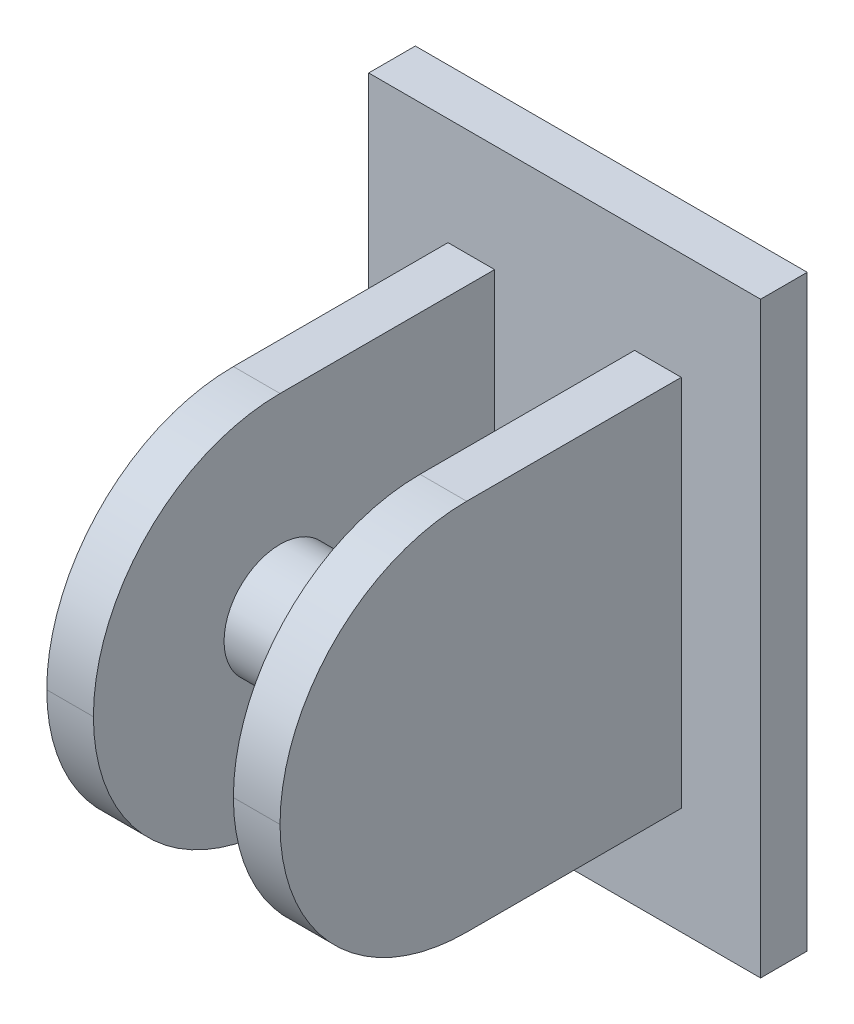
ISO-10303-21;
HEADER;
FILE_DESCRIPTION(('STEP AP214'),'2;1');
FILE_NAME('part.step','',(''),(''),'','','');
FILE_SCHEMA(('AUTOMOTIVE_DESIGN { 1 0 10303 214 1 1 1 1 }'));
ENDSEC;
DATA;
#1=APPLICATION_CONTEXT('core data for automotive mechanical design processes');
#2=APPLICATION_PROTOCOL_DEFINITION('international standard','automotive_design',2000,#1);
#3=PRODUCT_CONTEXT('',#1,'mechanical');
#4=PRODUCT('Part','Part','',(#3));
#5=PRODUCT_RELATED_PRODUCT_CATEGORY('part','',(#4));
#6=PRODUCT_DEFINITION_FORMATION('','',#4);
#7=PRODUCT_DEFINITION_CONTEXT('part definition',#1,'design');
#8=PRODUCT_DEFINITION('design','',#6,#7);
#9=PRODUCT_DEFINITION_SHAPE('','',#8);
#10=(LENGTH_UNIT() NAMED_UNIT(*) SI_UNIT(.MILLI.,.METRE.));
#11=(NAMED_UNIT(*) PLANE_ANGLE_UNIT() SI_UNIT($,.RADIAN.));
#12=(NAMED_UNIT(*) SI_UNIT($,.STERADIAN.) SOLID_ANGLE_UNIT());
#13=UNCERTAINTY_MEASURE_WITH_UNIT(LENGTH_MEASURE(1.E-05),#10,'distance_accuracy_value','');
#14=(GEOMETRIC_REPRESENTATION_CONTEXT(3) GLOBAL_UNCERTAINTY_ASSIGNED_CONTEXT((#13)) GLOBAL_UNIT_ASSIGNED_CONTEXT((#10,
#11,#12)) REPRESENTATION_CONTEXT('',''));
#15=CARTESIAN_POINT('',(0.,0.,0.));
#16=DIRECTION('',(0.,0.,1.));
#17=DIRECTION('',(1.,0.,0.));
#18=AXIS2_PLACEMENT_3D('',#15,#16,#17);
#19=CARTESIAN_POINT('',(-21.,-31.5,5.));
#20=DIRECTION('',(0.,0.,1.));
#21=DIRECTION('',(1.,0.,0.));
#22=AXIS2_PLACEMENT_3D('',#19,#20,#21);
#23=PLANE('',#22);
#24=DIRECTION('',(-1.,0.,0.));
#25=VECTOR('',#24,1.);
#26=CARTESIAN_POINT('',(-7.5,20.,5.));
#27=LINE('',#26,#25);
#28=CARTESIAN_POINT('',(-7.5,20.,5.));
#29=VERTEX_POINT('',#28);
#30=CARTESIAN_POINT('',(-12.5,20.,5.));
#31=VERTEX_POINT('',#30);
#32=EDGE_CURVE('E149',#29,#31,#27,.T.);
#33=ORIENTED_EDGE('',*,*,#32,.F.);
#34=DIRECTION('',(0.,1.,0.));
#35=VECTOR('',#34,1.);
#36=CARTESIAN_POINT('',(-7.5,20.,5.));
#37=LINE('',#36,#35);
#38=CARTESIAN_POINT('',(-7.5,-20.,5.));
#39=VERTEX_POINT('',#38);
#40=EDGE_CURVE('E123',#39,#29,#37,.T.);
#41=ORIENTED_EDGE('',*,*,#40,.F.);
#42=DIRECTION('',(1.,0.,0.));
#43=VECTOR('',#42,1.);
#44=CARTESIAN_POINT('',(-7.5,-20.,5.));
#45=LINE('',#44,#43);
#46=CARTESIAN_POINT('',(-12.5,-20.,5.));
#47=VERTEX_POINT('',#46);
#48=EDGE_CURVE('E155',#47,#39,#45,.T.);
#49=ORIENTED_EDGE('',*,*,#48,.F.);
#50=DIRECTION('',(0.,-1.,0.));
#51=VECTOR('',#50,1.);
#52=CARTESIAN_POINT('',(-12.5,20.,5.));
#53=LINE('',#52,#51);
#54=EDGE_CURVE('E152',#31,#47,#53,.T.);
#55=ORIENTED_EDGE('',*,*,#54,.F.);
#56=EDGE_LOOP('',(#33,#41,#49,#55));
#57=FACE_BOUND('',#56,.T.);
#58=DIRECTION('',(0.,-1.,0.));
#59=VECTOR('',#58,1.);
#60=CARTESIAN_POINT('',(-21.,31.5,5.));
#61=LINE('',#60,#59);
#62=CARTESIAN_POINT('',(-21.,31.5,5.));
#63=VERTEX_POINT('',#62);
#64=CARTESIAN_POINT('',(-21.,-31.5,5.));
#65=VERTEX_POINT('',#64);
#66=EDGE_CURVE('E175',#63,#65,#61,.T.);
#67=ORIENTED_EDGE('',*,*,#66,.T.);
#68=DIRECTION('',(1.,0.,0.));
#69=VECTOR('',#68,1.);
#70=CARTESIAN_POINT('',(-21.,-31.5,5.));
#71=LINE('',#70,#69);
#72=CARTESIAN_POINT('',(21.,-31.5,5.));
#73=VERTEX_POINT('',#72);
#74=EDGE_CURVE('E178',#65,#73,#71,.T.);
#75=ORIENTED_EDGE('',*,*,#74,.T.);
#76=DIRECTION('',(0.,1.,0.));
#77=VECTOR('',#76,1.);
#78=CARTESIAN_POINT('',(21.,31.5,5.));
#79=LINE('',#78,#77);
#80=CARTESIAN_POINT('',(21.,31.5,5.));
#81=VERTEX_POINT('',#80);
#82=EDGE_CURVE('E180',#73,#81,#79,.T.);
#83=ORIENTED_EDGE('',*,*,#82,.T.);
#84=DIRECTION('',(-1.,0.,0.));
#85=VECTOR('',#84,1.);
#86=CARTESIAN_POINT('',(-21.,31.5,5.));
#87=LINE('',#86,#85);
#88=EDGE_CURVE('E182',#81,#63,#87,.T.);
#89=ORIENTED_EDGE('',*,*,#88,.T.);
#90=EDGE_LOOP('',(#67,#75,#83,#89));
#91=FACE_BOUND('',#90,.T.);
#92=DIRECTION('',(1.,0.,0.));
#93=VECTOR('',#92,1.);
#94=CARTESIAN_POINT('',(7.5,-20.,5.));
#95=LINE('',#94,#93);
#96=CARTESIAN_POINT('',(7.5,-20.,5.));
#97=VERTEX_POINT('',#96);
#98=CARTESIAN_POINT('',(12.5,-20.,5.));
#99=VERTEX_POINT('',#98);
#100=EDGE_CURVE('E119',#97,#99,#95,.T.);
#101=ORIENTED_EDGE('',*,*,#100,.F.);
#102=DIRECTION('',(0.,-1.,0.));
#103=VECTOR('',#102,1.);
#104=CARTESIAN_POINT('',(7.5,20.,5.));
#105=LINE('',#104,#103);
#106=CARTESIAN_POINT('',(7.5,20.,5.));
#107=VERTEX_POINT('',#106);
#108=EDGE_CURVE('E127',#107,#97,#105,.T.);
#109=ORIENTED_EDGE('',*,*,#108,.F.);
#110=DIRECTION('',(-1.,0.,0.));
#111=VECTOR('',#110,1.);
#112=CARTESIAN_POINT('',(7.5,20.,5.));
#113=LINE('',#112,#111);
#114=CARTESIAN_POINT('',(12.5,20.,5.));
#115=VERTEX_POINT('',#114);
#116=EDGE_CURVE('E138',#115,#107,#113,.T.);
#117=ORIENTED_EDGE('',*,*,#116,.F.);
#118=DIRECTION('',(0.,1.,0.));
#119=VECTOR('',#118,1.);
#120=CARTESIAN_POINT('',(12.5,20.,5.));
#121=LINE('',#120,#119);
#122=EDGE_CURVE('E136',#99,#115,#121,.T.);
#123=ORIENTED_EDGE('',*,*,#122,.F.);
#124=EDGE_LOOP('',(#101,#109,#117,#123));
#125=FACE_BOUND('',#124,.T.);
#126=ADVANCED_FACE('F16',(#57,#91,#125),#23,.T.);
#127=CARTESIAN_POINT('',(-21.,31.5,5.));
#128=DIRECTION('',(1.,0.,0.));
#129=DIRECTION('',(0.,1.,0.));
#130=AXIS2_PLACEMENT_3D('',#127,#128,#129);
#131=PLANE('',#130);
#132=DIRECTION('',(0.,-1.,0.));
#133=VECTOR('',#132,1.);
#134=CARTESIAN_POINT('',(-21.,31.5,0.));
#135=LINE('',#134,#133);
#136=CARTESIAN_POINT('',(-21.,31.5,0.));
#137=VERTEX_POINT('',#136);
#138=CARTESIAN_POINT('',(-21.,-31.5,0.));
#139=VERTEX_POINT('',#138);
#140=EDGE_CURVE('E166',#137,#139,#135,.T.);
#141=ORIENTED_EDGE('',*,*,#140,.T.);
#142=DIRECTION('',(0.,0.,-1.));
#143=VECTOR('',#142,1.);
#144=CARTESIAN_POINT('',(-21.,-31.5,5.));
#145=LINE('',#144,#143);
#146=EDGE_CURVE('E193',#65,#139,#145,.T.);
#147=ORIENTED_EDGE('',*,*,#146,.F.);
#148=ORIENTED_EDGE('',*,*,#66,.F.);
#149=DIRECTION('',(0.,0.,-1.));
#150=VECTOR('',#149,1.);
#151=CARTESIAN_POINT('',(-21.,31.5,5.));
#152=LINE('',#151,#150);
#153=EDGE_CURVE('E184',#63,#137,#152,.T.);
#154=ORIENTED_EDGE('',*,*,#153,.T.);
#155=EDGE_LOOP('',(#141,#147,#148,#154));
#156=FACE_BOUND('',#155,.T.);
#157=ADVANCED_FACE('F18',(#156),#131,.F.);
#158=CARTESIAN_POINT('',(-21.,-31.5,5.));
#159=DIRECTION('',(0.,1.,0.));
#160=DIRECTION('',(0.,0.,1.));
#161=AXIS2_PLACEMENT_3D('',#158,#159,#160);
#162=PLANE('',#161);
#163=DIRECTION('',(1.,0.,0.));
#164=VECTOR('',#163,1.);
#165=CARTESIAN_POINT('',(-21.,-31.5,0.));
#166=LINE('',#165,#164);
#167=CARTESIAN_POINT('',(21.,-31.5,0.));
#168=VERTEX_POINT('',#167);
#169=EDGE_CURVE('E169',#139,#168,#166,.T.);
#170=ORIENTED_EDGE('',*,*,#169,.T.);
#171=DIRECTION('',(0.,0.,-1.));
#172=VECTOR('',#171,1.);
#173=CARTESIAN_POINT('',(21.,-31.5,5.));
#174=LINE('',#173,#172);
#175=EDGE_CURVE('E190',#73,#168,#174,.T.);
#176=ORIENTED_EDGE('',*,*,#175,.F.);
#177=ORIENTED_EDGE('',*,*,#74,.F.);
#178=ORIENTED_EDGE('',*,*,#146,.T.);
#179=EDGE_LOOP('',(#170,#176,#177,#178));
#180=FACE_BOUND('',#179,.T.);
#181=ADVANCED_FACE('F248',(#180),#162,.F.);
#182=CARTESIAN_POINT('',(21.,31.5,5.));
#183=DIRECTION('',(-1.,0.,0.));
#184=DIRECTION('',(0.,-1.,0.));
#185=AXIS2_PLACEMENT_3D('',#182,#183,#184);
#186=PLANE('',#185);
#187=DIRECTION('',(0.,1.,0.));
#188=VECTOR('',#187,1.);
#189=CARTESIAN_POINT('',(21.,31.5,0.));
#190=LINE('',#189,#188);
#191=CARTESIAN_POINT('',(21.,31.5,0.));
#192=VERTEX_POINT('',#191);
#193=EDGE_CURVE('E171',#168,#192,#190,.T.);
#194=ORIENTED_EDGE('',*,*,#193,.T.);
#195=DIRECTION('',(0.,0.,-1.));
#196=VECTOR('',#195,1.);
#197=CARTESIAN_POINT('',(21.,31.5,5.));
#198=LINE('',#197,#196);
#199=EDGE_CURVE('E187',#81,#192,#198,.T.);
#200=ORIENTED_EDGE('',*,*,#199,.F.);
#201=ORIENTED_EDGE('',*,*,#82,.F.);
#202=ORIENTED_EDGE('',*,*,#175,.T.);
#203=EDGE_LOOP('',(#194,#200,#201,#202));
#204=FACE_BOUND('',#203,.T.);
#205=ADVANCED_FACE('F259',(#204),#186,.F.);
#206=CARTESIAN_POINT('',(-21.,31.5,5.));
#207=DIRECTION('',(0.,-1.,0.));
#208=DIRECTION('',(0.,0.,-1.));
#209=AXIS2_PLACEMENT_3D('',#206,#207,#208);
#210=PLANE('',#209);
#211=DIRECTION('',(-1.,0.,0.));
#212=VECTOR('',#211,1.);
#213=CARTESIAN_POINT('',(-21.,31.5,0.));
#214=LINE('',#213,#212);
#215=EDGE_CURVE('E173',#192,#137,#214,.T.);
#216=ORIENTED_EDGE('',*,*,#215,.T.);
#217=ORIENTED_EDGE('',*,*,#153,.F.);
#218=ORIENTED_EDGE('',*,*,#88,.F.);
#219=ORIENTED_EDGE('',*,*,#199,.T.);
#220=EDGE_LOOP('',(#216,#217,#218,#219));
#221=FACE_BOUND('',#220,.T.);
#222=ADVANCED_FACE('F256',(#221),#210,.F.);
#223=CARTESIAN_POINT('',(-21.,-31.5,0.));
#224=DIRECTION('',(0.,0.,1.));
#225=DIRECTION('',(1.,0.,0.));
#226=AXIS2_PLACEMENT_3D('',#223,#224,#225);
#227=PLANE('',#226);
#228=ORIENTED_EDGE('',*,*,#140,.F.);
#229=ORIENTED_EDGE('',*,*,#215,.F.);
#230=ORIENTED_EDGE('',*,*,#193,.F.);
#231=ORIENTED_EDGE('',*,*,#169,.F.);
#232=EDGE_LOOP('',(#228,#229,#230,#231));
#233=FACE_BOUND('',#232,.T.);
#234=ADVANCED_FACE('F254',(#233),#227,.F.);
#235=CARTESIAN_POINT('',(-7.5,20.,48.));
#236=DIRECTION('',(-1.,0.,0.));
#237=DIRECTION('',(0.,-1.,0.));
#238=AXIS2_PLACEMENT_3D('',#235,#236,#237);
#239=PLANE('',#238);
#240=CARTESIAN_POINT('',(-7.5,0.,28.));
#241=DIRECTION('',(-1.,0.,0.));
#242=DIRECTION('',(0.,-1.,0.));
#243=AXIS2_PLACEMENT_3D('',#240,#241,#242);
#244=CIRCLE('',#243,6.);
#245=CARTESIAN_POINT('',(-7.5,-6.,28.));
#246=VERTEX_POINT('',#245);
#247=EDGE_CURVE('E227',#246,#246,#244,.T.);
#248=ORIENTED_EDGE('',*,*,#247,.T.);
#249=EDGE_LOOP('',(#248));
#250=FACE_BOUND('',#249,.T.);
#251=CARTESIAN_POINT('',(-7.5,0.,28.));
#252=DIRECTION('',(-1.,0.,0.));
#253=DIRECTION('',(0.,-1.,0.));
#254=AXIS2_PLACEMENT_3D('',#251,#252,#253);
#255=CIRCLE('',#254,20.);
#256=CARTESIAN_POINT('',(-7.5,20.,28.));
#257=VERTEX_POINT('',#256);
#258=CARTESIAN_POINT('',(-7.5,0.,48.));
#259=VERTEX_POINT('',#258);
#260=EDGE_CURVE('E196',#257,#259,#255,.F.);
#261=ORIENTED_EDGE('',*,*,#260,.T.);
#262=CARTESIAN_POINT('',(-7.5,0.,28.));
#263=DIRECTION('',(-1.,0.,0.));
#264=DIRECTION('',(0.,-1.,0.));
#265=AXIS2_PLACEMENT_3D('',#262,#263,#264);
#266=CIRCLE('',#265,20.);
#267=CARTESIAN_POINT('',(-7.5,-20.,28.));
#268=VERTEX_POINT('',#267);
#269=EDGE_CURVE('E198',#259,#268,#266,.F.);
#270=ORIENTED_EDGE('',*,*,#269,.T.);
#271=DIRECTION('',(0.,0.,-1.));
#272=VECTOR('',#271,1.);
#273=CARTESIAN_POINT('',(-7.5,-20.,48.));
#274=LINE('',#273,#272);
#275=EDGE_CURVE('E158',#268,#39,#274,.T.);
#276=ORIENTED_EDGE('',*,*,#275,.T.);
#277=ORIENTED_EDGE('',*,*,#40,.T.);
#278=DIRECTION('',(0.,0.,-1.));
#279=VECTOR('',#278,1.);
#280=CARTESIAN_POINT('',(-7.5,20.,48.));
#281=LINE('',#280,#279);
#282=EDGE_CURVE('E164',#257,#29,#281,.T.);
#283=ORIENTED_EDGE('',*,*,#282,.F.);
#284=EDGE_LOOP('',(#261,#270,#276,#277,#283));
#285=FACE_BOUND('',#284,.T.);
#286=ADVANCED_FACE('F279',(#250,#285),#239,.F.);
#287=CARTESIAN_POINT('',(-7.5,20.,48.));
#288=DIRECTION('',(0.,-1.,0.));
#289=DIRECTION('',(0.,0.,-1.));
#290=AXIS2_PLACEMENT_3D('',#287,#288,#289);
#291=PLANE('',#290);
#292=DIRECTION('',(0.,0.,-1.));
#293=VECTOR('',#292,1.);
#294=CARTESIAN_POINT('',(-12.5,20.,48.));
#295=LINE('',#294,#293);
#296=CARTESIAN_POINT('',(-12.5,20.,28.));
#297=VERTEX_POINT('',#296);
#298=EDGE_CURVE('E162',#297,#31,#295,.T.);
#299=ORIENTED_EDGE('',*,*,#298,.F.);
#300=DIRECTION('',(-1.,0.,0.));
#301=VECTOR('',#300,1.);
#302=CARTESIAN_POINT('',(-7.5,20.,28.));
#303=LINE('',#302,#301);
#304=EDGE_CURVE('E11',#297,#257,#303,.F.);
#305=ORIENTED_EDGE('',*,*,#304,.T.);
#306=ORIENTED_EDGE('',*,*,#282,.T.);
#307=ORIENTED_EDGE('',*,*,#32,.T.);
#308=EDGE_LOOP('',(#299,#305,#306,#307));
#309=FACE_BOUND('',#308,.T.);
#310=ADVANCED_FACE('F283',(#309),#291,.F.);
#311=CARTESIAN_POINT('',(-12.5,20.,48.));
#312=DIRECTION('',(1.,0.,0.));
#313=DIRECTION('',(0.,1.,0.));
#314=AXIS2_PLACEMENT_3D('',#311,#312,#313);
#315=PLANE('',#314);
#316=DIRECTION('',(0.,0.,-1.));
#317=VECTOR('',#316,1.);
#318=CARTESIAN_POINT('',(-12.5,-20.,48.));
#319=LINE('',#318,#317);
#320=CARTESIAN_POINT('',(-12.5,-20.,28.));
#321=VERTEX_POINT('',#320);
#322=EDGE_CURVE('E160',#321,#47,#319,.T.);
#323=ORIENTED_EDGE('',*,*,#322,.F.);
#324=CARTESIAN_POINT('',(-12.5,0.,28.));
#325=DIRECTION('',(1.,0.,0.));
#326=DIRECTION('',(0.,1.,0.));
#327=AXIS2_PLACEMENT_3D('',#324,#325,#326);
#328=CIRCLE('',#327,20.);
#329=CARTESIAN_POINT('',(-12.5,0.,48.));
#330=VERTEX_POINT('',#329);
#331=EDGE_CURVE('E205',#321,#330,#328,.F.);
#332=ORIENTED_EDGE('',*,*,#331,.T.);
#333=CARTESIAN_POINT('',(-12.5,0.,28.));
#334=DIRECTION('',(1.,0.,0.));
#335=DIRECTION('',(0.,1.,0.));
#336=AXIS2_PLACEMENT_3D('',#333,#334,#335);
#337=CIRCLE('',#336,20.);
#338=EDGE_CURVE('E203',#330,#297,#337,.F.);
#339=ORIENTED_EDGE('',*,*,#338,.T.);
#340=ORIENTED_EDGE('',*,*,#298,.T.);
#341=ORIENTED_EDGE('',*,*,#54,.T.);
#342=EDGE_LOOP('',(#323,#332,#339,#340,#341));
#343=FACE_BOUND('',#342,.T.);
#344=ADVANCED_FACE('F288',(#343),#315,.F.);
#345=CARTESIAN_POINT('',(-7.5,-20.,48.));
#346=DIRECTION('',(0.,1.,0.));
#347=DIRECTION('',(-1.,0.,0.));
#348=AXIS2_PLACEMENT_3D('',#345,#346,#347);
#349=PLANE('',#348);
#350=ORIENTED_EDGE('',*,*,#275,.F.);
#351=DIRECTION('',(1.,0.,0.));
#352=VECTOR('',#351,1.);
#353=CARTESIAN_POINT('',(-7.5,-20.,28.));
#354=LINE('',#353,#352);
#355=EDGE_CURVE('E200',#268,#321,#354,.F.);
#356=ORIENTED_EDGE('',*,*,#355,.T.);
#357=ORIENTED_EDGE('',*,*,#322,.T.);
#358=ORIENTED_EDGE('',*,*,#48,.T.);
#359=EDGE_LOOP('',(#350,#356,#357,#358));
#360=FACE_BOUND('',#359,.T.);
#361=ADVANCED_FACE('F296',(#360),#349,.F.);
#362=CARTESIAN_POINT('',(7.5,20.,48.));
#363=DIRECTION('',(1.,0.,0.));
#364=DIRECTION('',(0.,1.,0.));
#365=AXIS2_PLACEMENT_3D('',#362,#363,#364);
#366=PLANE('',#365);
#367=CARTESIAN_POINT('',(7.5,0.,28.));
#368=DIRECTION('',(1.,0.,0.));
#369=DIRECTION('',(0.,1.,0.));
#370=AXIS2_PLACEMENT_3D('',#367,#368,#369);
#371=CIRCLE('',#370,6.);
#372=CARTESIAN_POINT('',(7.5,6.,28.));
#373=VERTEX_POINT('',#372);
#374=EDGE_CURVE('E334',#373,#373,#371,.T.);
#375=ORIENTED_EDGE('',*,*,#374,.T.);
#376=EDGE_LOOP('',(#375));
#377=FACE_BOUND('',#376,.T.);
#378=DIRECTION('',(0.,0.,-1.));
#379=VECTOR('',#378,1.);
#380=CARTESIAN_POINT('',(7.5,-20.,48.));
#381=LINE('',#380,#379);
#382=CARTESIAN_POINT('',(7.5,-20.,28.));
#383=VERTEX_POINT('',#382);
#384=EDGE_CURVE('E114',#383,#97,#381,.T.);
#385=ORIENTED_EDGE('',*,*,#384,.F.);
#386=CARTESIAN_POINT('',(7.5,0.,28.));
#387=DIRECTION('',(1.,0.,0.));
#388=DIRECTION('',(0.,1.,0.));
#389=AXIS2_PLACEMENT_3D('',#386,#387,#388);
#390=CIRCLE('',#389,20.);
#391=CARTESIAN_POINT('',(7.5,0.,48.));
#392=VERTEX_POINT('',#391);
#393=EDGE_CURVE('E36',#383,#392,#390,.F.);
#394=ORIENTED_EDGE('',*,*,#393,.T.);
#395=CARTESIAN_POINT('',(7.5,0.,28.));
#396=DIRECTION('',(1.,0.,0.));
#397=DIRECTION('',(0.,1.,0.));
#398=AXIS2_PLACEMENT_3D('',#395,#396,#397);
#399=CIRCLE('',#398,20.);
#400=CARTESIAN_POINT('',(7.5,20.,28.));
#401=VERTEX_POINT('',#400);
#402=EDGE_CURVE('E31',#392,#401,#399,.F.);
#403=ORIENTED_EDGE('',*,*,#402,.T.);
#404=DIRECTION('',(0.,0.,-1.));
#405=VECTOR('',#404,1.);
#406=CARTESIAN_POINT('',(7.5,20.,48.));
#407=LINE('',#406,#405);
#408=EDGE_CURVE('E129',#401,#107,#407,.T.);
#409=ORIENTED_EDGE('',*,*,#408,.T.);
#410=ORIENTED_EDGE('',*,*,#108,.T.);
#411=EDGE_LOOP('',(#385,#394,#403,#409,#410));
#412=FACE_BOUND('',#411,.T.);
#413=ADVANCED_FACE('F128',(#377,#412),#366,.F.);
#414=CARTESIAN_POINT('',(7.5,-20.,48.));
#415=DIRECTION('',(0.,1.,0.));
#416=DIRECTION('',(0.,0.,1.));
#417=AXIS2_PLACEMENT_3D('',#414,#415,#416);
#418=PLANE('',#417);
#419=DIRECTION('',(0.,0.,-1.));
#420=VECTOR('',#419,1.);
#421=CARTESIAN_POINT('',(12.5,-20.,48.));
#422=LINE('',#421,#420);
#423=CARTESIAN_POINT('',(12.5,-20.,28.));
#424=VERTEX_POINT('',#423);
#425=EDGE_CURVE('E124',#424,#99,#422,.T.);
#426=ORIENTED_EDGE('',*,*,#425,.F.);
#427=DIRECTION('',(1.,0.,0.));
#428=VECTOR('',#427,1.);
#429=CARTESIAN_POINT('',(7.5,-20.,28.));
#430=LINE('',#429,#428);
#431=EDGE_CURVE('E122',#424,#383,#430,.F.);
#432=ORIENTED_EDGE('',*,*,#431,.T.);
#433=ORIENTED_EDGE('',*,*,#384,.T.);
#434=ORIENTED_EDGE('',*,*,#100,.T.);
#435=EDGE_LOOP('',(#426,#432,#433,#434));
#436=FACE_BOUND('',#435,.T.);
#437=ADVANCED_FACE('F117',(#436),#418,.F.);
#438=CARTESIAN_POINT('',(12.5,20.,48.));
#439=DIRECTION('',(-1.,0.,0.));
#440=DIRECTION('',(0.,-1.,0.));
#441=AXIS2_PLACEMENT_3D('',#438,#439,#440);
#442=PLANE('',#441);
#443=CARTESIAN_POINT('',(12.5,0.,28.));
#444=DIRECTION('',(-1.,0.,0.));
#445=DIRECTION('',(0.,-1.,0.));
#446=AXIS2_PLACEMENT_3D('',#443,#444,#445);
#447=CIRCLE('',#446,20.);
#448=CARTESIAN_POINT('',(12.5,20.,28.));
#449=VERTEX_POINT('',#448);
#450=CARTESIAN_POINT('',(12.5,0.,48.));
#451=VERTEX_POINT('',#450);
#452=EDGE_CURVE('E207',#449,#451,#447,.F.);
#453=ORIENTED_EDGE('',*,*,#452,.T.);
#454=CARTESIAN_POINT('',(12.5,0.,28.));
#455=DIRECTION('',(-1.,0.,0.));
#456=DIRECTION('',(0.,-1.,0.));
#457=AXIS2_PLACEMENT_3D('',#454,#455,#456);
#458=CIRCLE('',#457,20.);
#459=EDGE_CURVE('E209',#451,#424,#458,.F.);
#460=ORIENTED_EDGE('',*,*,#459,.T.);
#461=ORIENTED_EDGE('',*,*,#425,.T.);
#462=ORIENTED_EDGE('',*,*,#122,.T.);
#463=DIRECTION('',(0.,0.,-1.));
#464=VECTOR('',#463,1.);
#465=CARTESIAN_POINT('',(12.5,20.,48.));
#466=LINE('',#465,#464);
#467=EDGE_CURVE('E144',#449,#115,#466,.T.);
#468=ORIENTED_EDGE('',*,*,#467,.F.);
#469=EDGE_LOOP('',(#453,#460,#461,#462,#468));
#470=FACE_BOUND('',#469,.T.);
#471=ADVANCED_FACE('F220',(#470),#442,.F.);
#472=CARTESIAN_POINT('',(7.5,20.,48.));
#473=DIRECTION('',(0.,-1.,0.));
#474=DIRECTION('',(0.,0.,-1.));
#475=AXIS2_PLACEMENT_3D('',#472,#473,#474);
#476=PLANE('',#475);
#477=ORIENTED_EDGE('',*,*,#408,.F.);
#478=DIRECTION('',(-1.,0.,0.));
#479=VECTOR('',#478,1.);
#480=CARTESIAN_POINT('',(12.5,20.,28.));
#481=LINE('',#480,#479);
#482=EDGE_CURVE('E24',#401,#449,#481,.F.);
#483=ORIENTED_EDGE('',*,*,#482,.T.);
#484=ORIENTED_EDGE('',*,*,#467,.T.);
#485=ORIENTED_EDGE('',*,*,#116,.T.);
#486=EDGE_LOOP('',(#477,#483,#484,#485));
#487=FACE_BOUND('',#486,.T.);
#488=ADVANCED_FACE('F216',(#487),#476,.F.);
#489=CARTESIAN_POINT('',(-7.5,0.,28.));
#490=DIRECTION('',(-1.,0.,0.));
#491=DIRECTION('',(0.,0.,1.));
#492=AXIS2_PLACEMENT_3D('',#489,#490,#491);
#493=CYLINDRICAL_SURFACE('',#492,20.);
#494=ORIENTED_EDGE('',*,*,#304,.F.);
#495=ORIENTED_EDGE('',*,*,#338,.F.);
#496=DIRECTION('',(-1.,0.,0.));
#497=VECTOR('',#496,1.);
#498=CARTESIAN_POINT('',(-7.5,0.,48.));
#499=LINE('',#498,#497);
#500=EDGE_CURVE('E133',#259,#330,#499,.T.);
#501=ORIENTED_EDGE('',*,*,#500,.F.);
#502=ORIENTED_EDGE('',*,*,#260,.F.);
#503=EDGE_LOOP('',(#494,#495,#501,#502));
#504=FACE_BOUND('',#503,.T.);
#505=ADVANCED_FACE('F310',(#504),#493,.T.);
#506=CARTESIAN_POINT('',(-7.5,0.,28.));
#507=DIRECTION('',(1.,0.,0.));
#508=DIRECTION('',(0.,1.,0.));
#509=AXIS2_PLACEMENT_3D('',#506,#507,#508);
#510=CYLINDRICAL_SURFACE('',#509,20.);
#511=ORIENTED_EDGE('',*,*,#331,.F.);
#512=ORIENTED_EDGE('',*,*,#355,.F.);
#513=ORIENTED_EDGE('',*,*,#269,.F.);
#514=ORIENTED_EDGE('',*,*,#500,.T.);
#515=EDGE_LOOP('',(#511,#512,#513,#514));
#516=FACE_BOUND('',#515,.T.);
#517=ADVANCED_FACE('F240',(#516),#510,.T.);
#518=CARTESIAN_POINT('',(7.5,0.,28.));
#519=DIRECTION('',(1.,0.,0.));
#520=DIRECTION('',(0.,0.,-1.));
#521=AXIS2_PLACEMENT_3D('',#518,#519,#520);
#522=CYLINDRICAL_SURFACE('',#521,20.);
#523=ORIENTED_EDGE('',*,*,#482,.F.);
#524=ORIENTED_EDGE('',*,*,#402,.F.);
#525=DIRECTION('',(-1.,0.,0.));
#526=VECTOR('',#525,1.);
#527=CARTESIAN_POINT('',(7.5,0.,48.));
#528=LINE('',#527,#526);
#529=EDGE_CURVE('E224',#451,#392,#528,.T.);
#530=ORIENTED_EDGE('',*,*,#529,.F.);
#531=ORIENTED_EDGE('',*,*,#452,.F.);
#532=EDGE_LOOP('',(#523,#524,#530,#531));
#533=FACE_BOUND('',#532,.T.);
#534=ADVANCED_FACE('F222',(#533),#522,.T.);
#535=CARTESIAN_POINT('',(7.5,0.,28.));
#536=DIRECTION('',(-1.,0.,0.));
#537=DIRECTION('',(0.,0.,1.));
#538=AXIS2_PLACEMENT_3D('',#535,#536,#537);
#539=CYLINDRICAL_SURFACE('',#538,20.);
#540=ORIENTED_EDGE('',*,*,#393,.F.);
#541=ORIENTED_EDGE('',*,*,#431,.F.);
#542=ORIENTED_EDGE('',*,*,#459,.F.);
#543=ORIENTED_EDGE('',*,*,#529,.T.);
#544=EDGE_LOOP('',(#540,#541,#542,#543));
#545=FACE_BOUND('',#544,.T.);
#546=ADVANCED_FACE('F229',(#545),#539,.T.);
#547=CARTESIAN_POINT('',(-29.4705627484771,0.,28.));
#548=DIRECTION('',(1.,0.,0.));
#549=DIRECTION('',(0.,1.,0.));
#550=AXIS2_PLACEMENT_3D('',#547,#548,#549);
#551=CYLINDRICAL_SURFACE('',#550,6.);
#552=ORIENTED_EDGE('',*,*,#374,.F.);
#553=EDGE_LOOP('',(#552));
#554=FACE_BOUND('',#553,.T.);
#555=ORIENTED_EDGE('',*,*,#247,.F.);
#556=EDGE_LOOP('',(#555));
#557=FACE_BOUND('',#556,.T.);
#558=ADVANCED_FACE('F231',(#554,#557),#551,.T.);
#559=CLOSED_SHELL('',(#126,#157,#181,#205,#222,#234,#286,#310,#344,#361,#413,#437,#471,#488,
#505,#517,#534,#546,#558));
#560=MANIFOLD_SOLID_BREP('B1',#559);
#561=ADVANCED_BREP_SHAPE_REPRESENTATION('',(#18,#560),#14);
#562=SHAPE_DEFINITION_REPRESENTATION(#9,#561);
ENDSEC;
END-ISO-10303-21;
